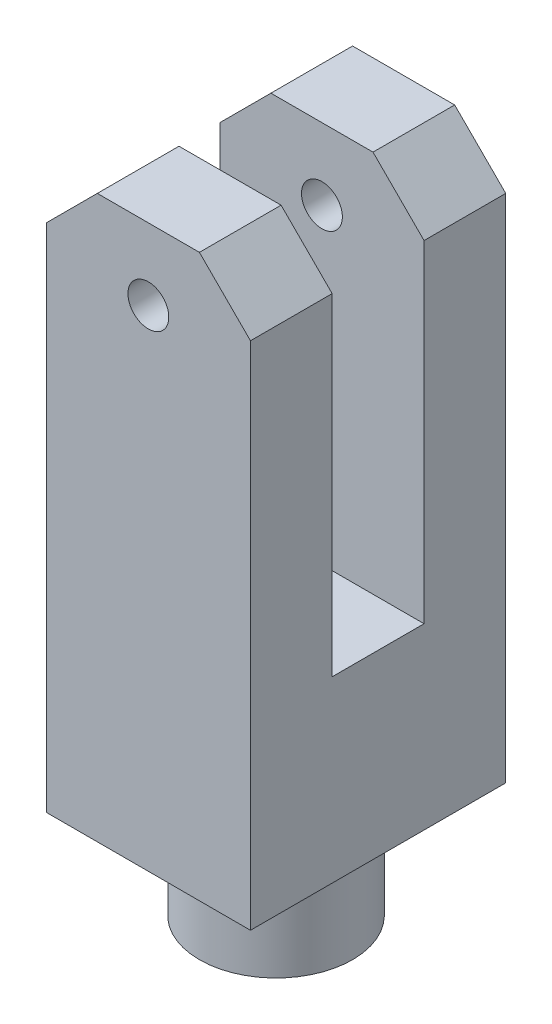
ISO-10303-21;
HEADER;
FILE_DESCRIPTION(('STEP AP214'),'2;1');
FILE_NAME('part.step','',(''),(''),'','','');
FILE_SCHEMA(('AUTOMOTIVE_DESIGN { 1 0 10303 214 1 1 1 1 }'));
ENDSEC;
DATA;
#1=APPLICATION_CONTEXT('core data for automotive mechanical design processes');
#2=APPLICATION_PROTOCOL_DEFINITION('international standard','automotive_design',2000,#1);
#3=PRODUCT_CONTEXT('',#1,'mechanical');
#4=PRODUCT('Part','Part','',(#3));
#5=PRODUCT_RELATED_PRODUCT_CATEGORY('part','',(#4));
#6=PRODUCT_DEFINITION_FORMATION('','',#4);
#7=PRODUCT_DEFINITION_CONTEXT('part definition',#1,'design');
#8=PRODUCT_DEFINITION('design','',#6,#7);
#9=PRODUCT_DEFINITION_SHAPE('','',#8);
#10=(LENGTH_UNIT() NAMED_UNIT(*) SI_UNIT(.MILLI.,.METRE.));
#11=(NAMED_UNIT(*) PLANE_ANGLE_UNIT() SI_UNIT($,.RADIAN.));
#12=(NAMED_UNIT(*) SI_UNIT($,.STERADIAN.) SOLID_ANGLE_UNIT());
#13=UNCERTAINTY_MEASURE_WITH_UNIT(LENGTH_MEASURE(1.E-05),#10,'distance_accuracy_value','');
#14=(GEOMETRIC_REPRESENTATION_CONTEXT(3) GLOBAL_UNCERTAINTY_ASSIGNED_CONTEXT((#13)) GLOBAL_UNIT_ASSIGNED_CONTEXT((#10,
#11,#12)) REPRESENTATION_CONTEXT('',''));
#15=CARTESIAN_POINT('',(0.,0.,0.));
#16=DIRECTION('',(0.,0.,1.));
#17=DIRECTION('',(1.,0.,0.));
#18=AXIS2_PLACEMENT_3D('',#15,#16,#17);
#19=CARTESIAN_POINT('',(0.,130.,0.));
#20=DIRECTION('',(0.,1.,0.));
#21=DIRECTION('',(0.,0.,1.));
#22=AXIS2_PLACEMENT_3D('',#19,#20,#21);
#23=PLANE('',#22);
#24=DIRECTION('',(-1.,0.,0.));
#25=VECTOR('',#24,1.);
#26=CARTESIAN_POINT('',(-20.,130.,-25.));
#27=LINE('',#26,#25);
#28=CARTESIAN_POINT('',(10.,130.,-25.));
#29=VERTEX_POINT('',#28);
#30=CARTESIAN_POINT('',(-9.99999999999999,130.,-25.));
#31=VERTEX_POINT('',#30);
#32=EDGE_CURVE('E157',#29,#31,#27,.T.);
#33=ORIENTED_EDGE('',*,*,#32,.T.);
#34=DIRECTION('',(0.,0.,1.));
#35=VECTOR('',#34,1.);
#36=CARTESIAN_POINT('',(-9.99999999999999,130.,-8.99999999999999));
#37=LINE('',#36,#35);
#38=CARTESIAN_POINT('',(-9.99999999999999,130.,-9.));
#39=VERTEX_POINT('',#38);
#40=EDGE_CURVE('E218',#31,#39,#37,.T.);
#41=ORIENTED_EDGE('',*,*,#40,.T.);
#42=DIRECTION('',(-1.,0.,0.));
#43=VECTOR('',#42,1.);
#44=CARTESIAN_POINT('',(0.,130.,-9.));
#45=LINE('',#44,#43);
#46=CARTESIAN_POINT('',(10.,130.,-9.));
#47=VERTEX_POINT('',#46);
#48=EDGE_CURVE('E191',#47,#39,#45,.T.);
#49=ORIENTED_EDGE('',*,*,#48,.F.);
#50=DIRECTION('',(0.,0.,-1.));
#51=VECTOR('',#50,1.);
#52=CARTESIAN_POINT('',(10.,130.,-25.));
#53=LINE('',#52,#51);
#54=EDGE_CURVE('E215',#47,#29,#53,.T.);
#55=ORIENTED_EDGE('',*,*,#54,.T.);
#56=EDGE_LOOP('',(#33,#41,#49,#55));
#57=FACE_BOUND('',#56,.T.);
#58=ADVANCED_FACE('F33',(#57),#23,.T.);
#59=CARTESIAN_POINT('',(0.,20.,0.));
#60=DIRECTION('',(0.,-1.,0.));
#61=DIRECTION('',(0.,0.,-1.));
#62=AXIS2_PLACEMENT_3D('',#59,#60,#61);
#63=CYLINDRICAL_SURFACE('',#62,15.);
#64=CARTESIAN_POINT('',(0.,20.,0.));
#65=DIRECTION('',(0.,1.,0.));
#66=DIRECTION('',(0.,0.,1.));
#67=AXIS2_PLACEMENT_3D('',#64,#65,#66);
#68=CIRCLE('',#67,15.);
#69=CARTESIAN_POINT('',(0.,20.,15.));
#70=VERTEX_POINT('',#69);
#71=EDGE_CURVE('E183',#70,#70,#68,.T.);
#72=ORIENTED_EDGE('',*,*,#71,.F.);
#73=EDGE_LOOP('',(#72));
#74=FACE_BOUND('',#73,.T.);
#75=CARTESIAN_POINT('',(0.,0.,0.));
#76=DIRECTION('',(0.,1.,0.));
#77=DIRECTION('',(0.,0.,1.));
#78=AXIS2_PLACEMENT_3D('',#75,#76,#77);
#79=CIRCLE('',#78,15.);
#80=CARTESIAN_POINT('',(0.,0.,15.));
#81=VERTEX_POINT('',#80);
#82=EDGE_CURVE('E182',#81,#81,#79,.T.);
#83=ORIENTED_EDGE('',*,*,#82,.T.);
#84=EDGE_LOOP('',(#83));
#85=FACE_BOUND('',#84,.T.);
#86=ADVANCED_FACE('F290',(#74,#85),#63,.T.);
#87=CARTESIAN_POINT('',(0.,0.,0.));
#88=DIRECTION('',(0.,1.,0.));
#89=DIRECTION('',(0.,0.,1.));
#90=AXIS2_PLACEMENT_3D('',#87,#88,#89);
#91=PLANE('',#90);
#92=ORIENTED_EDGE('',*,*,#82,.F.);
#93=EDGE_LOOP('',(#92));
#94=FACE_BOUND('',#93,.T.);
#95=ADVANCED_FACE('F297',(#94),#91,.F.);
#96=CARTESIAN_POINT('',(0.,20.,0.));
#97=DIRECTION('',(0.,1.,0.));
#98=DIRECTION('',(0.,0.,1.));
#99=AXIS2_PLACEMENT_3D('',#96,#97,#98);
#100=PLANE('',#99);
#101=DIRECTION('',(0.,0.,-1.));
#102=VECTOR('',#101,1.);
#103=CARTESIAN_POINT('',(20.,20.,-25.));
#104=LINE('',#103,#102);
#105=CARTESIAN_POINT('',(20.,20.,25.));
#106=VERTEX_POINT('',#105);
#107=CARTESIAN_POINT('',(20.,20.,-25.));
#108=VERTEX_POINT('',#107);
#109=EDGE_CURVE('E155',#106,#108,#104,.T.);
#110=ORIENTED_EDGE('',*,*,#109,.F.);
#111=DIRECTION('',(1.,0.,0.));
#112=VECTOR('',#111,1.);
#113=CARTESIAN_POINT('',(-20.,20.,25.));
#114=LINE('',#113,#112);
#115=CARTESIAN_POINT('',(-20.,20.,25.));
#116=VERTEX_POINT('',#115);
#117=EDGE_CURVE('E161',#116,#106,#114,.T.);
#118=ORIENTED_EDGE('',*,*,#117,.F.);
#119=DIRECTION('',(0.,0.,1.));
#120=VECTOR('',#119,1.);
#121=CARTESIAN_POINT('',(-20.,20.,-25.));
#122=LINE('',#121,#120);
#123=CARTESIAN_POINT('',(-20.,20.,-25.));
#124=VERTEX_POINT('',#123);
#125=EDGE_CURVE('E170',#124,#116,#122,.T.);
#126=ORIENTED_EDGE('',*,*,#125,.F.);
#127=DIRECTION('',(-1.,0.,0.));
#128=VECTOR('',#127,1.);
#129=CARTESIAN_POINT('',(-20.,20.,-25.));
#130=LINE('',#129,#128);
#131=EDGE_CURVE('E167',#108,#124,#130,.T.);
#132=ORIENTED_EDGE('',*,*,#131,.F.);
#133=EDGE_LOOP('',(#110,#118,#126,#132));
#134=FACE_BOUND('',#133,.T.);
#135=ORIENTED_EDGE('',*,*,#71,.T.);
#136=EDGE_LOOP('',(#135));
#137=FACE_BOUND('',#136,.T.);
#138=ADVANCED_FACE('F248',(#134,#137),#100,.F.);
#139=CARTESIAN_POINT('',(20.,130.,-25.));
#140=DIRECTION('',(-1.,0.,0.));
#141=DIRECTION('',(0.,0.,1.));
#142=AXIS2_PLACEMENT_3D('',#139,#140,#141);
#143=PLANE('',#142);
#144=DIRECTION('',(0.,-1.,0.));
#145=VECTOR('',#144,1.);
#146=CARTESIAN_POINT('',(20.,130.,-25.));
#147=LINE('',#146,#145);
#148=CARTESIAN_POINT('',(20.,120.,-25.));
#149=VERTEX_POINT('',#148);
#150=EDGE_CURVE('E180',#149,#108,#147,.T.);
#151=ORIENTED_EDGE('',*,*,#150,.F.);
#152=DIRECTION('',(0.,0.,1.));
#153=VECTOR('',#152,1.);
#154=CARTESIAN_POINT('',(20.,120.,-9.));
#155=LINE('',#154,#153);
#156=CARTESIAN_POINT('',(20.,120.,-9.));
#157=VERTEX_POINT('',#156);
#158=EDGE_CURVE('E11',#149,#157,#155,.T.);
#159=ORIENTED_EDGE('',*,*,#158,.T.);
#160=DIRECTION('',(0.,1.,0.));
#161=VECTOR('',#160,1.);
#162=CARTESIAN_POINT('',(20.,205.,-8.99999999999999));
#163=LINE('',#162,#161);
#164=CARTESIAN_POINT('',(20.,55.,-9.00000000000001));
#165=VERTEX_POINT('',#164);
#166=EDGE_CURVE('E149',#165,#157,#163,.T.);
#167=ORIENTED_EDGE('',*,*,#166,.F.);
#168=DIRECTION('',(0.,0.,-1.));
#169=VECTOR('',#168,1.);
#170=CARTESIAN_POINT('',(20.,55.,8.99999999999999));
#171=LINE('',#170,#169);
#172=CARTESIAN_POINT('',(20.,55.,8.99999999999999));
#173=VERTEX_POINT('',#172);
#174=EDGE_CURVE('E153',#173,#165,#171,.T.);
#175=ORIENTED_EDGE('',*,*,#174,.F.);
#176=DIRECTION('',(0.,-1.,0.));
#177=VECTOR('',#176,1.);
#178=CARTESIAN_POINT('',(20.,205.,9.00000000000001));
#179=LINE('',#178,#177);
#180=CARTESIAN_POINT('',(20.,120.,9.));
#181=VERTEX_POINT('',#180);
#182=EDGE_CURVE('E138',#181,#173,#179,.T.);
#183=ORIENTED_EDGE('',*,*,#182,.F.);
#184=DIRECTION('',(0.,0.,1.));
#185=VECTOR('',#184,1.);
#186=CARTESIAN_POINT('',(20.,120.,25.));
#187=LINE('',#186,#185);
#188=CARTESIAN_POINT('',(20.,120.,25.));
#189=VERTEX_POINT('',#188);
#190=EDGE_CURVE('E41',#181,#189,#187,.T.);
#191=ORIENTED_EDGE('',*,*,#190,.T.);
#192=DIRECTION('',(0.,-1.,0.));
#193=VECTOR('',#192,1.);
#194=CARTESIAN_POINT('',(20.,130.,25.));
#195=LINE('',#194,#193);
#196=EDGE_CURVE('E164',#189,#106,#195,.T.);
#197=ORIENTED_EDGE('',*,*,#196,.T.);
#198=ORIENTED_EDGE('',*,*,#109,.T.);
#199=EDGE_LOOP('',(#151,#159,#167,#175,#183,#191,#197,#198));
#200=FACE_BOUND('',#199,.T.);
#201=ADVANCED_FACE('F229',(#200),#143,.F.);
#202=CARTESIAN_POINT('',(-20.,130.,-25.));
#203=DIRECTION('',(0.,0.,1.));
#204=DIRECTION('',(1.,0.,0.));
#205=AXIS2_PLACEMENT_3D('',#202,#203,#204);
#206=PLANE('',#205);
#207=CARTESIAN_POINT('',(0.,116.,-25.));
#208=DIRECTION('',(0.,0.,-1.));
#209=DIRECTION('',(-1.,0.,0.));
#210=AXIS2_PLACEMENT_3D('',#207,#208,#209);
#211=CIRCLE('',#210,4.);
#212=CARTESIAN_POINT('',(-4.00000000000001,116.,-25.));
#213=VERTEX_POINT('',#212);
#214=EDGE_CURVE('E266',#213,#213,#211,.T.);
#215=ORIENTED_EDGE('',*,*,#214,.F.);
#216=EDGE_LOOP('',(#215));
#217=FACE_BOUND('',#216,.T.);
#218=DIRECTION('',(0.,-1.,0.));
#219=VECTOR('',#218,1.);
#220=CARTESIAN_POINT('',(-20.,130.,-25.));
#221=LINE('',#220,#219);
#222=CARTESIAN_POINT('',(-20.,120.,-25.));
#223=VERTEX_POINT('',#222);
#224=EDGE_CURVE('E178',#223,#124,#221,.T.);
#225=ORIENTED_EDGE('',*,*,#224,.F.);
#226=DIRECTION('',(0.707106781186547,0.707106781186549,0.));
#227=VECTOR('',#226,1.);
#228=CARTESIAN_POINT('',(-9.99999999999999,130.,-25.));
#229=LINE('',#228,#227);
#230=EDGE_CURVE('E226',#223,#31,#229,.T.);
#231=ORIENTED_EDGE('',*,*,#230,.T.);
#232=ORIENTED_EDGE('',*,*,#32,.F.);
#233=DIRECTION('',(0.707106781186547,-0.707106781186548,0.));
#234=VECTOR('',#233,1.);
#235=CARTESIAN_POINT('',(10.,130.,-25.));
#236=LINE('',#235,#234);
#237=EDGE_CURVE('E48',#29,#149,#236,.T.);
#238=ORIENTED_EDGE('',*,*,#237,.T.);
#239=ORIENTED_EDGE('',*,*,#150,.T.);
#240=ORIENTED_EDGE('',*,*,#131,.T.);
#241=EDGE_LOOP('',(#225,#231,#232,#238,#239,#240));
#242=FACE_BOUND('',#241,.T.);
#243=ADVANCED_FACE('F310',(#217,#242),#206,.F.);
#244=CARTESIAN_POINT('',(-20.,130.,-25.));
#245=DIRECTION('',(1.,0.,0.));
#246=DIRECTION('',(0.,0.,-1.));
#247=AXIS2_PLACEMENT_3D('',#244,#245,#246);
#248=PLANE('',#247);
#249=DIRECTION('',(0.,-1.,0.));
#250=VECTOR('',#249,1.);
#251=CARTESIAN_POINT('',(-20.,130.,25.));
#252=LINE('',#251,#250);
#253=CARTESIAN_POINT('',(-20.,120.,25.));
#254=VERTEX_POINT('',#253);
#255=EDGE_CURVE('E176',#254,#116,#252,.T.);
#256=ORIENTED_EDGE('',*,*,#255,.F.);
#257=DIRECTION('',(0.,0.,-1.));
#258=VECTOR('',#257,1.);
#259=CARTESIAN_POINT('',(-20.,120.,9.00000000000001));
#260=LINE('',#259,#258);
#261=CARTESIAN_POINT('',(-20.,120.,9.00000000000001));
#262=VERTEX_POINT('',#261);
#263=EDGE_CURVE('E129',#254,#262,#260,.T.);
#264=ORIENTED_EDGE('',*,*,#263,.T.);
#265=DIRECTION('',(0.,-1.,0.));
#266=VECTOR('',#265,1.);
#267=CARTESIAN_POINT('',(-20.,205.,9.00000000000001));
#268=LINE('',#267,#266);
#269=CARTESIAN_POINT('',(-20.,55.,9.));
#270=VERTEX_POINT('',#269);
#271=EDGE_CURVE('E121',#262,#270,#268,.T.);
#272=ORIENTED_EDGE('',*,*,#271,.T.);
#273=DIRECTION('',(0.,0.,-1.));
#274=VECTOR('',#273,1.);
#275=CARTESIAN_POINT('',(-20.,55.,9.));
#276=LINE('',#275,#274);
#277=CARTESIAN_POINT('',(-20.,55.,-9.));
#278=VERTEX_POINT('',#277);
#279=EDGE_CURVE('E127',#270,#278,#276,.T.);
#280=ORIENTED_EDGE('',*,*,#279,.T.);
#281=DIRECTION('',(0.,1.,0.));
#282=VECTOR('',#281,1.);
#283=CARTESIAN_POINT('',(-20.,205.,-8.99999999999998));
#284=LINE('',#283,#282);
#285=CARTESIAN_POINT('',(-20.,120.,-8.99999999999999));
#286=VERTEX_POINT('',#285);
#287=EDGE_CURVE('E132',#278,#286,#284,.T.);
#288=ORIENTED_EDGE('',*,*,#287,.T.);
#289=DIRECTION('',(0.,0.,-1.));
#290=VECTOR('',#289,1.);
#291=CARTESIAN_POINT('',(-20.,120.,-25.));
#292=LINE('',#291,#290);
#293=EDGE_CURVE('E208',#286,#223,#292,.T.);
#294=ORIENTED_EDGE('',*,*,#293,.T.);
#295=ORIENTED_EDGE('',*,*,#224,.T.);
#296=ORIENTED_EDGE('',*,*,#125,.T.);
#297=EDGE_LOOP('',(#256,#264,#272,#280,#288,#294,#295,#296));
#298=FACE_BOUND('',#297,.T.);
#299=ADVANCED_FACE('F124',(#298),#248,.F.);
#300=CARTESIAN_POINT('',(-20.,130.,25.));
#301=DIRECTION('',(0.,0.,-1.));
#302=DIRECTION('',(-1.,0.,0.));
#303=AXIS2_PLACEMENT_3D('',#300,#301,#302);
#304=PLANE('',#303);
#305=CARTESIAN_POINT('',(0.,116.,25.));
#306=DIRECTION('',(0.,0.,-1.));
#307=DIRECTION('',(-1.,0.,0.));
#308=AXIS2_PLACEMENT_3D('',#305,#306,#307);
#309=CIRCLE('',#308,4.);
#310=CARTESIAN_POINT('',(-4.00000000000001,116.,25.));
#311=VERTEX_POINT('',#310);
#312=EDGE_CURVE('E198',#311,#311,#309,.T.);
#313=ORIENTED_EDGE('',*,*,#312,.T.);
#314=EDGE_LOOP('',(#313));
#315=FACE_BOUND('',#314,.T.);
#316=DIRECTION('',(1.,0.,0.));
#317=VECTOR('',#316,1.);
#318=CARTESIAN_POINT('',(-20.,130.,25.));
#319=LINE('',#318,#317);
#320=CARTESIAN_POINT('',(-9.99999999999999,130.,25.));
#321=VERTEX_POINT('',#320);
#322=CARTESIAN_POINT('',(10.,130.,25.));
#323=VERTEX_POINT('',#322);
#324=EDGE_CURVE('E160',#321,#323,#319,.T.);
#325=ORIENTED_EDGE('',*,*,#324,.F.);
#326=DIRECTION('',(-0.707106781186547,-0.707106781186549,0.));
#327=VECTOR('',#326,1.);
#328=CARTESIAN_POINT('',(-9.99999999999999,130.,25.));
#329=LINE('',#328,#327);
#330=EDGE_CURVE('E206',#321,#254,#329,.T.);
#331=ORIENTED_EDGE('',*,*,#330,.T.);
#332=ORIENTED_EDGE('',*,*,#255,.T.);
#333=ORIENTED_EDGE('',*,*,#117,.T.);
#334=ORIENTED_EDGE('',*,*,#196,.F.);
#335=DIRECTION('',(-0.707106781186547,0.707106781186548,0.));
#336=VECTOR('',#335,1.);
#337=CARTESIAN_POINT('',(10.,130.,25.));
#338=LINE('',#337,#336);
#339=EDGE_CURVE('E204',#189,#323,#338,.T.);
#340=ORIENTED_EDGE('',*,*,#339,.T.);
#341=EDGE_LOOP('',(#325,#331,#332,#333,#334,#340));
#342=FACE_BOUND('',#341,.T.);
#343=ADVANCED_FACE('F234',(#315,#342),#304,.F.);
#344=DIRECTION('',(1.,0.,0.));
#345=VECTOR('',#344,1.);
#346=CARTESIAN_POINT('',(0.,130.,9.));
#347=LINE('',#346,#345);
#348=CARTESIAN_POINT('',(-9.99999999999999,130.,9.));
#349=VERTEX_POINT('',#348);
#350=CARTESIAN_POINT('',(10.,130.,9.));
#351=VERTEX_POINT('',#350);
#352=EDGE_CURVE('E186',#349,#351,#347,.T.);
#353=ORIENTED_EDGE('',*,*,#352,.F.);
#354=DIRECTION('',(0.,0.,1.));
#355=VECTOR('',#354,1.);
#356=CARTESIAN_POINT('',(-9.99999999999999,130.,25.));
#357=LINE('',#356,#355);
#358=EDGE_CURVE('E201',#349,#321,#357,.T.);
#359=ORIENTED_EDGE('',*,*,#358,.T.);
#360=ORIENTED_EDGE('',*,*,#324,.T.);
#361=DIRECTION('',(0.,0.,-1.));
#362=VECTOR('',#361,1.);
#363=CARTESIAN_POINT('',(10.,130.,9.));
#364=LINE('',#363,#362);
#365=EDGE_CURVE('E194',#323,#351,#364,.T.);
#366=ORIENTED_EDGE('',*,*,#365,.T.);
#367=EDGE_LOOP('',(#353,#359,#360,#366));
#368=FACE_BOUND('',#367,.T.);
#369=ADVANCED_FACE('F240',(#368),#23,.T.);
#370=CARTESIAN_POINT('',(-20.,205.,-8.99999999999998));
#371=DIRECTION('',(0.,0.,-1.));
#372=DIRECTION('',(-1.,0.,0.));
#373=AXIS2_PLACEMENT_3D('',#370,#371,#372);
#374=PLANE('',#373);
#375=CARTESIAN_POINT('',(0.,116.,-9.));
#376=DIRECTION('',(0.,0.,-1.));
#377=DIRECTION('',(-1.,0.,0.));
#378=AXIS2_PLACEMENT_3D('',#375,#376,#377);
#379=CIRCLE('',#378,4.);
#380=CARTESIAN_POINT('',(-4.00000000000001,116.,-9.));
#381=VERTEX_POINT('',#380);
#382=EDGE_CURVE('E151',#381,#381,#379,.T.);
#383=ORIENTED_EDGE('',*,*,#382,.T.);
#384=EDGE_LOOP('',(#383));
#385=FACE_BOUND('',#384,.T.);
#386=ORIENTED_EDGE('',*,*,#48,.T.);
#387=DIRECTION('',(-0.707106781186547,-0.707106781186549,0.));
#388=VECTOR('',#387,1.);
#389=CARTESIAN_POINT('',(-9.99999999999999,130.,-9.));
#390=LINE('',#389,#388);
#391=EDGE_CURVE('E223',#39,#286,#390,.T.);
#392=ORIENTED_EDGE('',*,*,#391,.T.);
#393=ORIENTED_EDGE('',*,*,#287,.F.);
#394=DIRECTION('',(1.,0.,0.));
#395=VECTOR('',#394,1.);
#396=CARTESIAN_POINT('',(-20.,55.,-9.));
#397=LINE('',#396,#395);
#398=EDGE_CURVE('E142',#278,#165,#397,.T.);
#399=ORIENTED_EDGE('',*,*,#398,.T.);
#400=ORIENTED_EDGE('',*,*,#166,.T.);
#401=DIRECTION('',(-0.707106781186547,0.707106781186548,0.));
#402=VECTOR('',#401,1.);
#403=CARTESIAN_POINT('',(10.,130.,-9.));
#404=LINE('',#403,#402);
#405=EDGE_CURVE('E221',#157,#47,#404,.T.);
#406=ORIENTED_EDGE('',*,*,#405,.T.);
#407=EDGE_LOOP('',(#386,#392,#393,#399,#400,#406));
#408=FACE_BOUND('',#407,.T.);
#409=ADVANCED_FACE('F256',(#385,#408),#374,.F.);
#410=CARTESIAN_POINT('',(-20.,55.,9.));
#411=DIRECTION('',(0.,-1.,0.));
#412=DIRECTION('',(0.,0.,-1.));
#413=AXIS2_PLACEMENT_3D('',#410,#411,#412);
#414=PLANE('',#413);
#415=ORIENTED_EDGE('',*,*,#174,.T.);
#416=ORIENTED_EDGE('',*,*,#398,.F.);
#417=ORIENTED_EDGE('',*,*,#279,.F.);
#418=DIRECTION('',(1.,0.,0.));
#419=VECTOR('',#418,1.);
#420=CARTESIAN_POINT('',(-20.,55.,9.));
#421=LINE('',#420,#419);
#422=EDGE_CURVE('E135',#270,#173,#421,.T.);
#423=ORIENTED_EDGE('',*,*,#422,.T.);
#424=EDGE_LOOP('',(#415,#416,#417,#423));
#425=FACE_BOUND('',#424,.T.);
#426=ADVANCED_FACE('F144',(#425),#414,.F.);
#427=CARTESIAN_POINT('',(-20.,205.,9.00000000000001));
#428=DIRECTION('',(0.,0.,1.));
#429=DIRECTION('',(1.,0.,0.));
#430=AXIS2_PLACEMENT_3D('',#427,#428,#429);
#431=PLANE('',#430);
#432=CARTESIAN_POINT('',(0.,116.,9.));
#433=DIRECTION('',(0.,0.,1.));
#434=DIRECTION('',(1.,0.,0.));
#435=AXIS2_PLACEMENT_3D('',#432,#433,#434);
#436=CIRCLE('',#435,4.);
#437=CARTESIAN_POINT('',(4.,116.,9.));
#438=VERTEX_POINT('',#437);
#439=EDGE_CURVE('E195',#438,#438,#436,.T.);
#440=ORIENTED_EDGE('',*,*,#439,.T.);
#441=EDGE_LOOP('',(#440));
#442=FACE_BOUND('',#441,.T.);
#443=ORIENTED_EDGE('',*,*,#271,.F.);
#444=DIRECTION('',(0.707106781186547,0.707106781186549,0.));
#445=VECTOR('',#444,1.);
#446=CARTESIAN_POINT('',(-9.99999999999999,130.,9.));
#447=LINE('',#446,#445);
#448=EDGE_CURVE('E213',#262,#349,#447,.T.);
#449=ORIENTED_EDGE('',*,*,#448,.T.);
#450=ORIENTED_EDGE('',*,*,#352,.T.);
#451=DIRECTION('',(0.707106781186547,-0.707106781186548,0.));
#452=VECTOR('',#451,1.);
#453=CARTESIAN_POINT('',(10.,130.,9.));
#454=LINE('',#453,#452);
#455=EDGE_CURVE('E211',#351,#181,#454,.T.);
#456=ORIENTED_EDGE('',*,*,#455,.T.);
#457=ORIENTED_EDGE('',*,*,#182,.T.);
#458=ORIENTED_EDGE('',*,*,#422,.F.);
#459=EDGE_LOOP('',(#443,#449,#450,#456,#457,#458));
#460=FACE_BOUND('',#459,.T.);
#461=ADVANCED_FACE('F136',(#442,#460),#431,.F.);
#462=CARTESIAN_POINT('',(0.,116.,25.));
#463=DIRECTION('',(0.,0.,-1.));
#464=DIRECTION('',(-1.,0.,0.));
#465=AXIS2_PLACEMENT_3D('',#462,#463,#464);
#466=CYLINDRICAL_SURFACE('',#465,4.);
#467=ORIENTED_EDGE('',*,*,#312,.F.);
#468=EDGE_LOOP('',(#467));
#469=FACE_BOUND('',#468,.T.);
#470=ORIENTED_EDGE('',*,*,#439,.F.);
#471=EDGE_LOOP('',(#470));
#472=FACE_BOUND('',#471,.T.);
#473=ADVANCED_FACE('F273',(#469,#472),#466,.F.);
#474=ORIENTED_EDGE('',*,*,#214,.T.);
#475=EDGE_LOOP('',(#474));
#476=FACE_BOUND('',#475,.T.);
#477=ORIENTED_EDGE('',*,*,#382,.F.);
#478=EDGE_LOOP('',(#477));
#479=FACE_BOUND('',#478,.T.);
#480=ADVANCED_FACE('F276',(#476,#479),#466,.F.);
#481=CARTESIAN_POINT('',(-9.99999999999999,130.,0.));
#482=DIRECTION('',(-0.707106781186549,0.707106781186547,0.));
#483=DIRECTION('',(0.,0.,-1.));
#484=AXIS2_PLACEMENT_3D('',#481,#482,#483);
#485=PLANE('',#484);
#486=ORIENTED_EDGE('',*,*,#448,.F.);
#487=ORIENTED_EDGE('',*,*,#263,.F.);
#488=ORIENTED_EDGE('',*,*,#330,.F.);
#489=ORIENTED_EDGE('',*,*,#358,.F.);
#490=EDGE_LOOP('',(#486,#487,#488,#489));
#491=FACE_BOUND('',#490,.T.);
#492=ADVANCED_FACE('F243',(#491),#485,.T.);
#493=CARTESIAN_POINT('',(-9.99999999999999,130.,0.));
#494=DIRECTION('',(-0.707106781186549,0.707106781186547,0.));
#495=DIRECTION('',(0.,0.,-1.));
#496=AXIS2_PLACEMENT_3D('',#493,#494,#495);
#497=PLANE('',#496);
#498=ORIENTED_EDGE('',*,*,#230,.F.);
#499=ORIENTED_EDGE('',*,*,#293,.F.);
#500=ORIENTED_EDGE('',*,*,#391,.F.);
#501=ORIENTED_EDGE('',*,*,#40,.F.);
#502=EDGE_LOOP('',(#498,#499,#500,#501));
#503=FACE_BOUND('',#502,.T.);
#504=ADVANCED_FACE('F261',(#503),#497,.T.);
#505=CARTESIAN_POINT('',(10.,130.,0.));
#506=DIRECTION('',(0.707106781186548,0.707106781186547,0.));
#507=DIRECTION('',(0.,0.,1.));
#508=AXIS2_PLACEMENT_3D('',#505,#506,#507);
#509=PLANE('',#508);
#510=ORIENTED_EDGE('',*,*,#405,.F.);
#511=ORIENTED_EDGE('',*,*,#158,.F.);
#512=ORIENTED_EDGE('',*,*,#237,.F.);
#513=ORIENTED_EDGE('',*,*,#54,.F.);
#514=EDGE_LOOP('',(#510,#511,#512,#513));
#515=FACE_BOUND('',#514,.T.);
#516=ADVANCED_FACE('F252',(#515),#509,.T.);
#517=CARTESIAN_POINT('',(10.,130.,0.));
#518=DIRECTION('',(0.707106781186548,0.707106781186547,0.));
#519=DIRECTION('',(0.,0.,1.));
#520=AXIS2_PLACEMENT_3D('',#517,#518,#519);
#521=PLANE('',#520);
#522=ORIENTED_EDGE('',*,*,#339,.F.);
#523=ORIENTED_EDGE('',*,*,#190,.F.);
#524=ORIENTED_EDGE('',*,*,#455,.F.);
#525=ORIENTED_EDGE('',*,*,#365,.F.);
#526=EDGE_LOOP('',(#522,#523,#524,#525));
#527=FACE_BOUND('',#526,.T.);
#528=ADVANCED_FACE('F35',(#527),#521,.T.);
#529=CLOSED_SHELL('',(#58,#86,#95,#138,#201,#243,#299,#343,#369,#409,#426,#461,#473,#480,#492,
#504,#516,#528));
#530=MANIFOLD_SOLID_BREP('B2',#529);
#531=ADVANCED_BREP_SHAPE_REPRESENTATION('',(#18,#530),#14);
#532=SHAPE_DEFINITION_REPRESENTATION(#9,#531);
ENDSEC;
END-ISO-10303-21;
